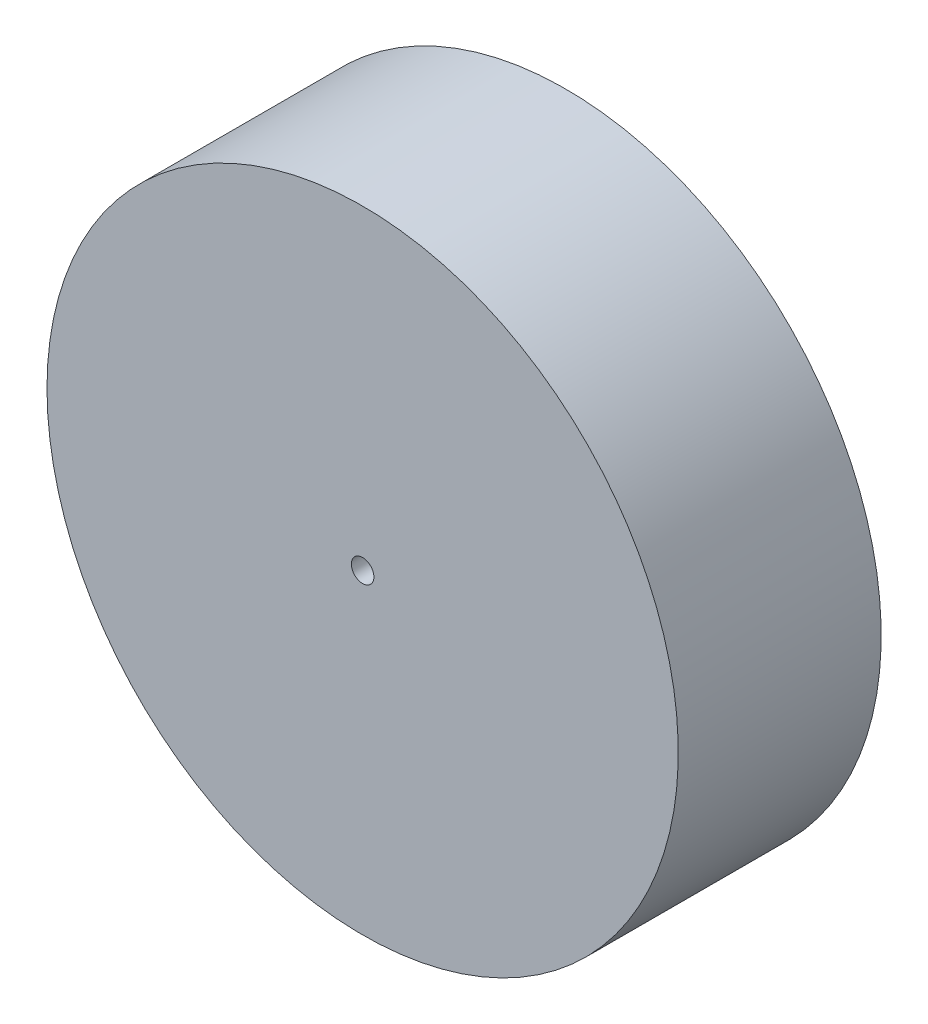
ISO-10303-21;
HEADER;
FILE_DESCRIPTION(('STEP AP214'),'2;1');
FILE_NAME('part.step','',(''),(''),'','','');
FILE_SCHEMA(('AUTOMOTIVE_DESIGN { 1 0 10303 214 1 1 1 1 }'));
ENDSEC;
DATA;
#1=APPLICATION_CONTEXT('core data for automotive mechanical design processes');
#2=APPLICATION_PROTOCOL_DEFINITION('international standard','automotive_design',2000,#1);
#3=PRODUCT_CONTEXT('',#1,'mechanical');
#4=PRODUCT('Part','Part','',(#3));
#5=PRODUCT_RELATED_PRODUCT_CATEGORY('part','',(#4));
#6=PRODUCT_DEFINITION_FORMATION('','',#4);
#7=PRODUCT_DEFINITION_CONTEXT('part definition',#1,'design');
#8=PRODUCT_DEFINITION('design','',#6,#7);
#9=PRODUCT_DEFINITION_SHAPE('','',#8);
#10=(LENGTH_UNIT() NAMED_UNIT(*) SI_UNIT(.MILLI.,.METRE.));
#11=(NAMED_UNIT(*) PLANE_ANGLE_UNIT() SI_UNIT($,.RADIAN.));
#12=(NAMED_UNIT(*) SI_UNIT($,.STERADIAN.) SOLID_ANGLE_UNIT());
#13=UNCERTAINTY_MEASURE_WITH_UNIT(LENGTH_MEASURE(1.E-05),#10,'distance_accuracy_value','');
#14=(GEOMETRIC_REPRESENTATION_CONTEXT(3) GLOBAL_UNCERTAINTY_ASSIGNED_CONTEXT((#13)) GLOBAL_UNIT_ASSIGNED_CONTEXT((#10,
#11,#12)) REPRESENTATION_CONTEXT('',''));
#15=CARTESIAN_POINT('',(0.,0.,0.));
#16=DIRECTION('',(0.,0.,1.));
#17=DIRECTION('',(1.,0.,0.));
#18=AXIS2_PLACEMENT_3D('',#15,#16,#17);
#19=CARTESIAN_POINT('',(0.,0.,45.));
#20=DIRECTION('',(0.,0.,-1.));
#21=DIRECTION('',(-1.,0.,0.));
#22=AXIS2_PLACEMENT_3D('',#19,#20,#21);
#23=CYLINDRICAL_SURFACE('',#22,70.);
#24=CARTESIAN_POINT('',(0.,0.,45.));
#25=DIRECTION('',(0.,0.,1.));
#26=DIRECTION('',(1.,0.,0.));
#27=AXIS2_PLACEMENT_3D('',#24,#25,#26);
#28=CIRCLE('',#27,70.);
#29=CARTESIAN_POINT('',(-70.,0.,45.));
#30=VERTEX_POINT('',#29);
#31=EDGE_CURVE('E10',#30,#30,#28,.T.);
#32=CARTESIAN_POINT('',(0.,0.,0.));
#33=DIRECTION('',(0.,0.,1.));
#34=DIRECTION('',(1.,0.,0.));
#35=AXIS2_PLACEMENT_3D('',#32,#33,#34);
#36=CIRCLE('',#35,70.);
#37=CARTESIAN_POINT('',(-70.,0.,0.));
#38=VERTEX_POINT('',#37);
#39=EDGE_CURVE('E39',#38,#38,#36,.T.);
#40=CARTESIAN_POINT('',(-70.,0.,45.));
#41=CARTESIAN_POINT('',(-70.,0.,44.53125));
#42=CARTESIAN_POINT('',(-70.,0.,44.0625));
#43=CARTESIAN_POINT('',(-70.,0.,43.125));
#44=CARTESIAN_POINT('',(-70.,0.,42.65625));
#45=CARTESIAN_POINT('',(-70.,0.,41.71875));
#46=CARTESIAN_POINT('',(-70.,0.,41.25));
#47=CARTESIAN_POINT('',(-70.,0.,40.3125));
#48=CARTESIAN_POINT('',(-70.,0.,39.84375));
#49=CARTESIAN_POINT('',(-70.,0.,38.90625));
#50=CARTESIAN_POINT('',(-70.,0.,38.4375));
#51=CARTESIAN_POINT('',(-70.,0.,37.5));
#52=CARTESIAN_POINT('',(-70.,0.,37.03125));
#53=CARTESIAN_POINT('',(-70.,0.,36.09375));
#54=CARTESIAN_POINT('',(-70.,0.,35.625));
#55=CARTESIAN_POINT('',(-70.,0.,34.6875));
#56=CARTESIAN_POINT('',(-70.,0.,34.21875));
#57=CARTESIAN_POINT('',(-70.,0.,33.28125));
#58=CARTESIAN_POINT('',(-70.,0.,32.8125));
#59=CARTESIAN_POINT('',(-70.,0.,31.875));
#60=CARTESIAN_POINT('',(-70.,0.,31.40625));
#61=CARTESIAN_POINT('',(-70.,0.,30.46875));
#62=CARTESIAN_POINT('',(-70.,0.,30.));
#63=CARTESIAN_POINT('',(-70.,0.,29.0625));
#64=CARTESIAN_POINT('',(-70.,0.,28.59375));
#65=CARTESIAN_POINT('',(-70.,0.,27.65625));
#66=CARTESIAN_POINT('',(-70.,0.,27.1875));
#67=CARTESIAN_POINT('',(-70.,0.,26.25));
#68=CARTESIAN_POINT('',(-70.,0.,25.78125));
#69=CARTESIAN_POINT('',(-70.,0.,24.84375));
#70=CARTESIAN_POINT('',(-70.,0.,24.375));
#71=CARTESIAN_POINT('',(-70.,0.,23.4375));
#72=CARTESIAN_POINT('',(-70.,0.,22.96875));
#73=CARTESIAN_POINT('',(-70.,0.,22.03125));
#74=CARTESIAN_POINT('',(-70.,0.,21.5625));
#75=CARTESIAN_POINT('',(-70.,0.,20.625));
#76=CARTESIAN_POINT('',(-70.,0.,20.15625));
#77=CARTESIAN_POINT('',(-70.,0.,19.21875));
#78=CARTESIAN_POINT('',(-70.,0.,18.75));
#79=CARTESIAN_POINT('',(-70.,0.,17.8125));
#80=CARTESIAN_POINT('',(-70.,0.,17.34375));
#81=CARTESIAN_POINT('',(-70.,0.,16.40625));
#82=CARTESIAN_POINT('',(-70.,0.,15.9375));
#83=CARTESIAN_POINT('',(-70.,0.,15.));
#84=CARTESIAN_POINT('',(-70.,0.,14.53125));
#85=CARTESIAN_POINT('',(-70.,0.,13.59375));
#86=CARTESIAN_POINT('',(-70.,0.,13.125));
#87=CARTESIAN_POINT('',(-70.,0.,12.1875));
#88=CARTESIAN_POINT('',(-70.,0.,11.71875));
#89=CARTESIAN_POINT('',(-70.,0.,10.78125));
#90=CARTESIAN_POINT('',(-70.,0.,10.3125));
#91=CARTESIAN_POINT('',(-70.,0.,9.37499999999999));
#92=CARTESIAN_POINT('',(-70.,0.,8.90624999999999));
#93=CARTESIAN_POINT('',(-70.,0.,7.96874999999999));
#94=CARTESIAN_POINT('',(-70.,0.,7.5));
#95=CARTESIAN_POINT('',(-70.,0.,6.56249999999999));
#96=CARTESIAN_POINT('',(-70.,0.,6.09374999999999));
#97=CARTESIAN_POINT('',(-70.,0.,5.15624999999999));
#98=CARTESIAN_POINT('',(-70.,0.,4.68749999999999));
#99=CARTESIAN_POINT('',(-70.,0.,3.74999999999999));
#100=CARTESIAN_POINT('',(-70.,0.,3.28124999999999));
#101=CARTESIAN_POINT('',(-70.,0.,2.34374999999999));
#102=CARTESIAN_POINT('',(-70.,0.,1.87499999999999));
#103=CARTESIAN_POINT('',(-70.,0.,0.937499999999992));
#104=CARTESIAN_POINT('',(-70.,0.,0.468749999999993));
#105=CARTESIAN_POINT('',(-70.,0.,0.));
#106=B_SPLINE_CURVE_WITH_KNOTS('',3,(#40,#41,#42,#43,#44,#45,#46,#47,#48,#49,#50,#51,#52,#53,
#54,#55,#56,#57,#58,#59,#60,#61,#62,#63,#64,#65,#66,#67,#68,#69,#70,#71,#72,#73,#74,#75,#76,#77,
#78,#79,#80,#81,#82,#83,#84,#85,#86,#87,#88,#89,#90,#91,#92,#93,#94,#95,#96,#97,#98,#99,#100,
#101,#102,#103,#104,#105),.UNSPECIFIED.,.F.,.F.,(4,2,2,2,2,2,2,2,2,2,2,2,2,2,2,2,2,2,2,2,2,2,2,
2,2,2,2,2,2,2,2,2,4),(0.,1.40625,2.8125,4.21874999999999,5.625,7.03125,8.43749999999999,9.84375,
11.25,12.65625,14.0625,15.46875,16.875,18.28125,19.6875,21.09375,22.5,23.90625,25.3125,26.71875,
28.125,29.53125,30.9375,32.34375,33.75,35.15625,36.5625,37.96875,39.375,40.78125,42.1875,
43.59375,45.),.UNSPECIFIED.);
#107=EDGE_CURVE('BSEAM36',#30,#38,#106,.T.);
#108=ORIENTED_EDGE('',*,*,#31,.F.);
#109=ORIENTED_EDGE('',*,*,#39,.T.);
#110=ORIENTED_EDGE('',*,*,#107,.T.);
#111=ORIENTED_EDGE('',*,*,#107,.F.);
#112=EDGE_LOOP('',(#108,#110,#109,#111));
#113=FACE_BOUND('',#112,.T.);
#114=ADVANCED_FACE('F36',(#113),#23,.T.);
#115=CARTESIAN_POINT('',(0.,0.,45.));
#116=DIRECTION('',(0.,0.,1.));
#117=DIRECTION('',(1.,0.,0.));
#118=AXIS2_PLACEMENT_3D('',#115,#116,#117);
#119=PLANE('',#118);
#120=CARTESIAN_POINT('',(0.,0.,45.));
#121=DIRECTION('',(0.,0.,1.));
#122=DIRECTION('',(1.,0.,0.));
#123=AXIS2_PLACEMENT_3D('',#120,#121,#122);
#124=CIRCLE('',#123,2.5);
#125=CARTESIAN_POINT('',(2.5,0.,45.));
#126=VERTEX_POINT('',#125);
#127=EDGE_CURVE('E50',#126,#126,#124,.T.);
#128=ORIENTED_EDGE('',*,*,#127,.F.);
#129=EDGE_LOOP('',(#128));
#130=FACE_BOUND('',#129,.T.);
#131=ORIENTED_EDGE('',*,*,#31,.T.);
#132=EDGE_LOOP('',(#131));
#133=FACE_BOUND('',#132,.T.);
#134=ADVANCED_FACE('F67',(#130,#133),#119,.T.);
#135=CARTESIAN_POINT('',(0.,0.,0.));
#136=DIRECTION('',(0.,0.,1.));
#137=DIRECTION('',(1.,0.,0.));
#138=AXIS2_PLACEMENT_3D('',#135,#136,#137);
#139=PLANE('',#138);
#140=ORIENTED_EDGE('',*,*,#39,.F.);
#141=EDGE_LOOP('',(#140));
#142=FACE_BOUND('',#141,.T.);
#143=ADVANCED_FACE('F63',(#142),#139,.F.);
#144=CARTESIAN_POINT('',(0.,0.,25.));
#145=DIRECTION('',(0.,0.,1.));
#146=DIRECTION('',(1.,0.,0.));
#147=AXIS2_PLACEMENT_3D('',#144,#145,#146);
#148=CYLINDRICAL_SURFACE('',#147,2.5);
#149=CARTESIAN_POINT('',(0.,0.,25.));
#150=DIRECTION('',(0.,0.,1.));
#151=DIRECTION('',(1.,0.,0.));
#152=AXIS2_PLACEMENT_3D('',#149,#150,#151);
#153=CIRCLE('',#152,2.5);
#154=CARTESIAN_POINT('',(2.5,0.,25.));
#155=VERTEX_POINT('',#154);
#156=EDGE_CURVE('E48',#155,#155,#153,.T.);
#157=ORIENTED_EDGE('',*,*,#156,.F.);
#158=EDGE_LOOP('',(#157));
#159=FACE_BOUND('',#158,.T.);
#160=ORIENTED_EDGE('',*,*,#127,.T.);
#161=EDGE_LOOP('',(#160));
#162=FACE_BOUND('',#161,.T.);
#163=ADVANCED_FACE('F60',(#159,#162),#148,.F.);
#164=CARTESIAN_POINT('',(0.,0.,25.));
#165=DIRECTION('',(0.,0.,1.));
#166=DIRECTION('',(1.,0.,0.));
#167=AXIS2_PLACEMENT_3D('',#164,#165,#166);
#168=PLANE('',#167);
#169=ORIENTED_EDGE('',*,*,#156,.T.);
#170=EDGE_LOOP('',(#169));
#171=FACE_BOUND('',#170,.T.);
#172=ADVANCED_FACE('F58',(#171),#168,.T.);
#173=CLOSED_SHELL('',(#114,#134,#143,#163,#172));
#174=MANIFOLD_SOLID_BREP('B2',#173);
#175=ADVANCED_BREP_SHAPE_REPRESENTATION('',(#18,#174),#14);
#176=SHAPE_DEFINITION_REPRESENTATION(#9,#175);
ENDSEC;
END-ISO-10303-21;
